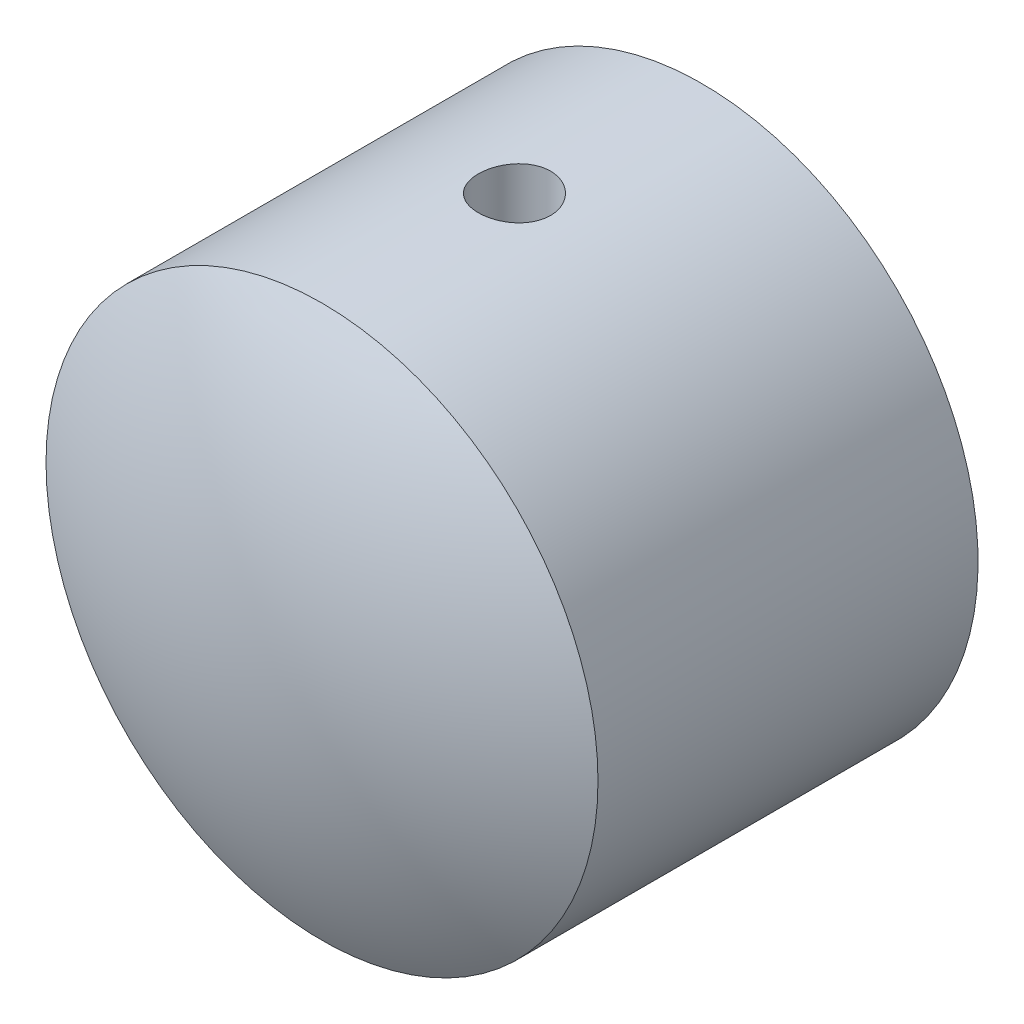
ISO-10303-21;
HEADER;
FILE_DESCRIPTION(('STEP AP214'),'2;1');
FILE_NAME('part.step','',(''),(''),'','','');
FILE_SCHEMA(('AUTOMOTIVE_DESIGN { 1 0 10303 214 1 1 1 1 }'));
ENDSEC;
DATA;
#1=APPLICATION_CONTEXT('core data for automotive mechanical design processes');
#2=APPLICATION_PROTOCOL_DEFINITION('international standard','automotive_design',2000,#1);
#3=PRODUCT_CONTEXT('',#1,'mechanical');
#4=PRODUCT('Part','Part','',(#3));
#5=PRODUCT_RELATED_PRODUCT_CATEGORY('part','',(#4));
#6=PRODUCT_DEFINITION_FORMATION('','',#4);
#7=PRODUCT_DEFINITION_CONTEXT('part definition',#1,'design');
#8=PRODUCT_DEFINITION('design','',#6,#7);
#9=PRODUCT_DEFINITION_SHAPE('','',#8);
#10=(LENGTH_UNIT() NAMED_UNIT(*) SI_UNIT(.MILLI.,.METRE.));
#11=(NAMED_UNIT(*) PLANE_ANGLE_UNIT() SI_UNIT($,.RADIAN.));
#12=(NAMED_UNIT(*) SI_UNIT($,.STERADIAN.) SOLID_ANGLE_UNIT());
#13=UNCERTAINTY_MEASURE_WITH_UNIT(LENGTH_MEASURE(1.E-05),#10,'distance_accuracy_value','');
#14=(GEOMETRIC_REPRESENTATION_CONTEXT(3) GLOBAL_UNCERTAINTY_ASSIGNED_CONTEXT((#13)) GLOBAL_UNIT_ASSIGNED_CONTEXT((#10,
#11,#12)) REPRESENTATION_CONTEXT('',''));
#15=CARTESIAN_POINT('',(0.,0.,0.));
#16=DIRECTION('',(0.,0.,1.));
#17=DIRECTION('',(1.,0.,0.));
#18=AXIS2_PLACEMENT_3D('',#15,#16,#17);
#19=CARTESIAN_POINT('',(67.1144928825525,307.327144706562,47.625));
#20=DIRECTION('',(0.,0.,-1.));
#21=DIRECTION('',(-1.,0.,0.));
#22=AXIS2_PLACEMENT_3D('',#19,#20,#21);
#23=CYLINDRICAL_SURFACE('',#22,36.4267675437894);
#24=CARTESIAN_POINT('',(67.1144928825528,270.900377162773,26.9874999999998));
#25=CARTESIAN_POINT('',(67.3807861241553,270.900381014889,26.9874887516836));
#26=CARTESIAN_POINT('',(67.6472432346548,270.903328005808,26.9650901565895));
#27=CARTESIAN_POINT('',(68.1727357439868,270.914800637117,26.8760953817906));
#28=CARTESIAN_POINT('',(68.4317632186264,270.923332018394,26.8094537181482));
#29=CARTESIAN_POINT('',(68.9347133640755,270.945012830305,26.6339759077728));
#30=CARTESIAN_POINT('',(69.1786463364318,270.958159069622,26.5251689142879));
#31=CARTESIAN_POINT('',(69.6447460131086,270.987609502614,26.2685145129294));
#32=CARTESIAN_POINT('',(69.8669162897577,271.003913176685,26.1206735272262));
#33=CARTESIAN_POINT('',(70.2845614529954,271.03796913155,25.7892001819833));
#34=CARTESIAN_POINT('',(70.4798869022755,271.055728707038,25.605380266732));
#35=CARTESIAN_POINT('',(70.8370103149681,271.09063640758,25.2075700118016));
#36=CARTESIAN_POINT('',(70.9988065249047,271.107784500616,24.9935780952027));
#37=CARTESIAN_POINT('',(71.2848409860774,271.139599166054,24.5405196705663));
#38=CARTESIAN_POINT('',(71.4089381977963,271.154256331489,24.3013634009049));
#39=CARTESIAN_POINT('',(71.6151511670651,271.179332535277,23.805380734277));
#40=CARTESIAN_POINT('',(71.6972686636197,271.189751749183,23.5485550697633));
#41=CARTESIAN_POINT('',(71.8167348050109,271.205102150723,23.026079865457));
#42=CARTESIAN_POINT('',(71.8543366125666,271.210064360996,22.7604891398812));
#43=CARTESIAN_POINT('',(71.8844875663208,271.214033661954,22.2267243598319));
#44=CARTESIAN_POINT('',(71.877038689033,271.213041013899,21.9585504192074));
#45=CARTESIAN_POINT('',(71.8175073336526,271.205241144207,21.4290011212375));
#46=CARTESIAN_POINT('',(71.7657043801783,271.198470338082,21.1675937272159));
#47=CARTESIAN_POINT('',(71.6193718028579,271.179933863407,20.6572142304974));
#48=CARTESIAN_POINT('',(71.5248412392056,271.168168084993,20.4082424014583));
#49=CARTESIAN_POINT('',(71.2954384627023,271.140926304809,19.9289368938399));
#50=CARTESIAN_POINT('',(71.1604454399105,271.125439220084,19.6986616923306));
#51=CARTESIAN_POINT('',(70.8540360397852,271.092508269374,19.2639271258059));
#52=CARTESIAN_POINT('',(70.6826178408722,271.075064305549,19.0594690526899));
#53=CARTESIAN_POINT('',(70.3066780451414,271.040023412352,18.680550615389));
#54=CARTESIAN_POINT('',(70.1019156403467,271.022426324795,18.5063290919186));
#55=CARTESIAN_POINT('',(69.6659272108465,270.989185295135,18.1946911571787));
#56=CARTESIAN_POINT('',(69.4347011149398,270.973541358286,18.0572748449378));
#57=CARTESIAN_POINT('',(68.9521598923842,270.945958248432,17.8231453242324));
#58=CARTESIAN_POINT('',(68.7008370629001,270.934020504607,17.7264478126355));
#59=CARTESIAN_POINT('',(68.1853303768899,270.915207543798,17.5766942269176));
#60=CARTESIAN_POINT('',(67.9211471801636,270.908332067386,17.5236359163864));
#61=CARTESIAN_POINT('',(67.389483267697,270.90045217565,17.4629781365744));
#62=CARTESIAN_POINT('',(67.1220406781685,270.899405287334,17.4550497951384));
#63=CARTESIAN_POINT('',(66.5896404839542,270.903185650703,17.4840080355571));
#64=CARTESIAN_POINT('',(66.3246828213981,270.908012765247,17.5208935711381));
#65=CARTESIAN_POINT('',(65.805749569647,270.922972348716,17.6381592425366));
#66=CARTESIAN_POINT('',(65.5517377784626,270.933085596716,17.7183818355404));
#67=CARTESIAN_POINT('',(65.0607721660446,270.95748567739,17.9198801043763));
#68=CARTESIAN_POINT('',(64.8238189734916,270.971772663784,18.0411572923033));
#69=CARTESIAN_POINT('',(64.3722328449381,271.003034410468,18.3221126446941));
#70=CARTESIAN_POINT('',(64.1577327475952,271.020023816181,18.4820026658527));
#71=CARTESIAN_POINT('',(63.7584949609788,271.054746030348,18.8353463038362));
#72=CARTESIAN_POINT('',(63.5737585693709,271.072478871172,19.0288013832981));
#73=CARTESIAN_POINT('',(63.2381189270215,271.106821188383,19.4452357124111));
#74=CARTESIAN_POINT('',(63.08743421788,271.123422955958,19.6683918324382));
#75=CARTESIAN_POINT('',(62.8256870754998,271.153494489676,20.1370389638466));
#76=CARTESIAN_POINT('',(62.7146237858622,271.166964323514,20.3825294923359));
#77=CARTESIAN_POINT('',(62.5356227684183,271.189193601434,20.8881832003715));
#78=CARTESIAN_POINT('',(62.4675635889551,271.197966300299,21.1483027783875));
#79=CARTESIAN_POINT('',(62.3761125250798,271.209845429407,21.6764010165034));
#80=CARTESIAN_POINT('',(62.3527183507961,271.212952150131,21.9443792729918));
#81=CARTESIAN_POINT('',(62.351306059454,271.213138572702,22.4784129773044));
#82=CARTESIAN_POINT('',(62.372944561122,271.210263883777,22.7444675660436));
#83=CARTESIAN_POINT('',(62.4602543747032,271.198909675481,23.2691228082971));
#84=CARTESIAN_POINT('',(62.5259256770981,271.190430157322,23.5277234634227));
#85=CARTESIAN_POINT('',(62.6993264677828,271.168836220301,24.0300741336865));
#86=CARTESIAN_POINT('',(62.8070377961547,271.155723802933,24.2738305085817));
#87=CARTESIAN_POINT('',(63.0614273652993,271.126338408777,24.7398653879614));
#88=CARTESIAN_POINT('',(63.2081062748798,271.110065377746,24.9621435237215));
#89=CARTESIAN_POINT('',(63.5375359659515,271.07604381269,25.380665523879));
#90=CARTESIAN_POINT('',(63.7205424025177,271.058285369323,25.5767073660973));
#91=CARTESIAN_POINT('',(64.1168963135129,271.023380410382,25.9354276736346));
#92=CARTESIAN_POINT('',(64.3302509065774,271.006234039562,26.0980982892839));
#93=CARTESIAN_POINT('',(64.7822685276633,270.974405763912,26.3860412856509));
#94=CARTESIAN_POINT('',(65.0210330089337,270.959734392745,26.5111555011815));
#95=CARTESIAN_POINT('',(65.5162472059345,270.93461490601,26.719330554709));
#96=CARTESIAN_POINT('',(65.7726775568158,270.924162249594,26.8024366329723));
#97=CARTESIAN_POINT('',(66.2110809992565,270.911149282279,26.9045637909272));
#98=CARTESIAN_POINT('',(66.3903010440371,270.907129642774,26.9356195756918));
#99=CARTESIAN_POINT('',(66.7511529334709,270.901742279823,26.9770914317823));
#100=CARTESIAN_POINT('',(66.9327847579771,270.900374534239,26.9875076754122));
#101=CARTESIAN_POINT('',(67.1144928825528,270.900377162773,26.9874999999998));
#102=B_SPLINE_CURVE_WITH_KNOTS('',3,(#24,#25,#26,#27,#28,#29,#30,#31,#32,#33,#34,#35,#36,#37,
#38,#39,#40,#41,#42,#43,#44,#45,#46,#47,#48,#49,#50,#51,#52,#53,#54,#55,#56,#57,#58,#59,#60,#61,
#62,#63,#64,#65,#66,#67,#68,#69,#70,#71,#72,#73,#74,#75,#76,#77,#78,#79,#80,#81,#82,#83,#84,#85,
#86,#87,#88,#89,#90,#91,#92,#93,#94,#95,#96,#97,#98,#99,#100,#101),.UNSPECIFIED.,.T.,.F.,(4,2,2,
2,2,2,2,2,2,2,2,2,2,2,2,2,2,2,2,2,2,2,2,2,2,2,2,2,2,2,2,2,2,2,2,2,2,2,4),(0.,0.798215948677364,
1.59725377392052,2.39574012462125,3.19409518402807,3.99672852472909,4.7994038300908,
5.6050461360937,6.41065506575209,7.21166010966651,8.01263001125435,8.80858895056784,
9.6045653980823,10.4029424985758,11.2013595343572,12.0058215909523,12.8102858120247,
13.6150598662385,14.4197926750345,15.2186536340678,16.0174959423803,16.8134535790941,
17.6094405351691,18.4098982230728,19.2103908006327,20.0158835376897,20.821358863332,
21.6245490869639,22.4276981317831,23.224745482981,24.0217926618844,24.8184959228148,
25.6152128585938,26.417749278105,27.2204742564875,28.0265338770913,28.8317235599864,
29.376399545873,29.9210709846511),.UNSPECIFIED.);
#103=CARTESIAN_POINT('',(67.1144928825528,270.900377162773,26.9874999999998));
#104=VERTEX_POINT('',#103);
#105=EDGE_CURVE('E10',#104,#104,#102,.T.);
#106=ORIENTED_EDGE('',*,*,#105,.T.);
#107=EDGE_LOOP('',(#106));
#108=FACE_BOUND('',#107,.T.);
#109=CARTESIAN_POINT('',(67.1144928825525,343.753912250352,26.9874999999998));
#110=CARTESIAN_POINT('',(66.8481996409499,343.753908398235,26.9874887516836));
#111=CARTESIAN_POINT('',(66.5817425304505,343.750961407316,26.9650901565894));
#112=CARTESIAN_POINT('',(66.0562500211185,343.739488776008,26.8760953817905));
#113=CARTESIAN_POINT('',(65.7972225464789,343.730957394731,26.8094537181481));
#114=CARTESIAN_POINT('',(65.2942724010298,343.709276582819,26.6339759077727));
#115=CARTESIAN_POINT('',(65.0503394286735,343.696130343502,26.5251689142877));
#116=CARTESIAN_POINT('',(64.5842397519967,343.666679910511,26.2685145129292));
#117=CARTESIAN_POINT('',(64.3620694753476,343.65037623644,26.1206735272261));
#118=CARTESIAN_POINT('',(63.9444243121099,343.616320281575,25.789200181983));
#119=CARTESIAN_POINT('',(63.7490988628298,343.598560706087,25.6053802667318));
#120=CARTESIAN_POINT('',(63.3919754501373,343.563653005545,25.2075700118013));
#121=CARTESIAN_POINT('',(63.2301792402006,343.546504912509,24.9935780952025));
#122=CARTESIAN_POINT('',(62.944144779028,343.514690247071,24.540519670566));
#123=CARTESIAN_POINT('',(62.8200475673091,343.500033081636,24.3013634009046));
#124=CARTESIAN_POINT('',(62.6138345980404,343.474956877848,23.8053807342767));
#125=CARTESIAN_POINT('',(62.5317171014858,343.464537663942,23.548555069763));
#126=CARTESIAN_POINT('',(62.4122509600946,343.449187262401,23.0260798654566));
#127=CARTESIAN_POINT('',(62.3746491525389,343.444225052129,22.7604891398809));
#128=CARTESIAN_POINT('',(62.3444981987847,343.440255751171,22.2267243598316));
#129=CARTESIAN_POINT('',(62.3519470760726,343.441248399226,21.9585504192071));
#130=CARTESIAN_POINT('',(62.411478431453,343.449048268917,21.4290011212372));
#131=CARTESIAN_POINT('',(62.4632813849273,343.455819075043,21.1675937272156));
#132=CARTESIAN_POINT('',(62.6096139622478,343.474355549718,20.6572142304971));
#133=CARTESIAN_POINT('',(62.7041445259001,343.486121328131,20.408242401458));
#134=CARTESIAN_POINT('',(62.9335473024035,343.513363108316,19.9289368938396));
#135=CARTESIAN_POINT('',(63.0685403251953,343.528850193041,19.6986616923303));
#136=CARTESIAN_POINT('',(63.3749497253205,343.561781143751,19.2639271258057));
#137=CARTESIAN_POINT('',(63.5463679242336,343.579225107576,19.0594690526897));
#138=CARTESIAN_POINT('',(63.9223077199644,343.614266000773,18.6805506153888));
#139=CARTESIAN_POINT('',(64.1270701247591,343.63186308833,18.5063290919184));
#140=CARTESIAN_POINT('',(64.5630585542593,343.66510411799,18.1946911571785));
#141=CARTESIAN_POINT('',(64.794284650166,343.680748054839,18.0572748449376));
#142=CARTESIAN_POINT('',(65.2768258727216,343.708331164693,17.8231453242323));
#143=CARTESIAN_POINT('',(65.5281487022058,343.720268908517,17.7264478126354));
#144=CARTESIAN_POINT('',(66.043655388216,343.739081869326,17.5766942269175));
#145=CARTESIAN_POINT('',(66.3078385849423,343.745957345739,17.5236359163863));
#146=CARTESIAN_POINT('',(66.8395024974089,343.753837237475,17.4629781365744));
#147=CARTESIAN_POINT('',(67.1069450869374,343.75488412579,17.4550497951384));
#148=CARTESIAN_POINT('',(67.6393452811517,343.751103762421,17.4840080355571));
#149=CARTESIAN_POINT('',(67.9043029437078,343.746276647878,17.5208935711381));
#150=CARTESIAN_POINT('',(68.4232361954588,343.731317064409,17.6381592425367));
#151=CARTESIAN_POINT('',(68.6772479866433,343.721203816409,17.7183818355405));
#152=CARTESIAN_POINT('',(69.1682135990613,343.696803735735,17.9198801043764));
#153=CARTESIAN_POINT('',(69.4051667916142,343.68251674934,18.0411572923035));
#154=CARTESIAN_POINT('',(69.8567529201677,343.651255002657,18.3221126446942));
#155=CARTESIAN_POINT('',(70.0712530175106,343.634265596944,18.4820026658529));
#156=CARTESIAN_POINT('',(70.470490804127,343.599543382777,18.8353463038364));
#157=CARTESIAN_POINT('',(70.6552271957349,343.581810541953,19.0288013832984));
#158=CARTESIAN_POINT('',(70.9908668380842,343.547468224741,19.4452357124114));
#159=CARTESIAN_POINT('',(71.1415515472257,343.530866457167,19.6683918324385));
#160=CARTESIAN_POINT('',(71.4032986896059,343.500794923448,20.1370389638469));
#161=CARTESIAN_POINT('',(71.5143619792435,343.487325089611,20.3825294923362));
#162=CARTESIAN_POINT('',(71.6933629966873,343.46509581169,20.8881832003719));
#163=CARTESIAN_POINT('',(71.7614221761506,343.456323112825,21.1483027783878));
#164=CARTESIAN_POINT('',(71.8528732400258,343.444443983718,21.6764010165037));
#165=CARTESIAN_POINT('',(71.8762674143095,343.441337262994,21.9443792729921));
#166=CARTESIAN_POINT('',(71.8776797056516,343.441150840423,22.4784129773047));
#167=CARTESIAN_POINT('',(71.8560412039836,343.444025529348,22.7444675660439));
#168=CARTESIAN_POINT('',(71.7687313904023,343.455379737643,23.2691228082974));
#169=CARTESIAN_POINT('',(71.7030600880074,343.463859255803,23.527723463423));
#170=CARTESIAN_POINT('',(71.5296592973226,343.485453192823,24.0300741336868));
#171=CARTESIAN_POINT('',(71.4219479689507,343.498565610192,24.273830508582));
#172=CARTESIAN_POINT('',(71.1675583998061,343.527951004347,24.7398653879616));
#173=CARTESIAN_POINT('',(71.0208794902256,343.544224035379,24.9621435237218));
#174=CARTESIAN_POINT('',(70.6914497991539,343.578245600435,25.3806655238792));
#175=CARTESIAN_POINT('',(70.5084433625877,343.596004043802,25.5767073660975));
#176=CARTESIAN_POINT('',(70.1120894515924,343.630909002743,25.9354276736348));
#177=CARTESIAN_POINT('',(69.8987348585279,343.648055373562,26.0980982892841));
#178=CARTESIAN_POINT('',(69.446717237442,343.679883649212,26.386041285651));
#179=CARTESIAN_POINT('',(69.2079527561716,343.69455502038,26.5111555011816));
#180=CARTESIAN_POINT('',(68.7127385591707,343.719674507115,26.7193305547091));
#181=CARTESIAN_POINT('',(68.4563082082895,343.730127163531,26.8024366329724));
#182=CARTESIAN_POINT('',(68.0179047658488,343.743140130845,26.9045637909273));
#183=CARTESIAN_POINT('',(67.8386847210681,343.747159770351,26.9356195756919));
#184=CARTESIAN_POINT('',(67.4778328316343,343.752547133302,26.9770914317823));
#185=CARTESIAN_POINT('',(67.2962010071281,343.753914878886,26.9875076754122));
#186=CARTESIAN_POINT('',(67.1144928825525,343.753912250352,26.9874999999998));
#187=B_SPLINE_CURVE_WITH_KNOTS('',3,(#109,#110,#111,#112,#113,#114,#115,#116,#117,#118,#119,
#120,#121,#122,#123,#124,#125,#126,#127,#128,#129,#130,#131,#132,#133,#134,#135,#136,#137,#138,
#139,#140,#141,#142,#143,#144,#145,#146,#147,#148,#149,#150,#151,#152,#153,#154,#155,#156,#157,
#158,#159,#160,#161,#162,#163,#164,#165,#166,#167,#168,#169,#170,#171,#172,#173,#174,#175,#176,
#177,#178,#179,#180,#181,#182,#183,#184,#185,#186),.UNSPECIFIED.,.T.,.F.,(4,2,2,2,2,2,2,2,2,2,2,
2,2,2,2,2,2,2,2,2,2,2,2,2,2,2,2,2,2,2,2,2,2,2,2,2,2,2,4),(0.,0.798215948677341,1.59725377392052,
2.39574012462125,3.19409518402807,3.99672852472908,4.79940383009079,5.6050461360937,
6.41065506575209,7.2116601096665,8.01263001125435,8.80858895056785,9.60456539808231,
10.4029424985758,11.2013595343572,12.0058215909523,12.8102858120247,13.6150598662385,
14.4197926750345,15.2186536340678,16.0174959423803,16.813453579094,17.6094405351691,
18.4098982230728,19.2103908006327,20.0158835376897,20.821358863332,21.6245490869639,
22.4276981317831,23.224745482981,24.0217926618844,24.8184959228148,25.6152128585938,
26.417749278105,27.2204742564875,28.0265338770913,28.8317235599864,29.376399545873,
29.9210709846511),.UNSPECIFIED.);
#188=CARTESIAN_POINT('',(67.1144928825525,343.753912250352,26.9874999999998));
#189=VERTEX_POINT('',#188);
#190=EDGE_CURVE('E41',#189,#189,#187,.T.);
#191=ORIENTED_EDGE('',*,*,#190,.T.);
#192=EDGE_LOOP('',(#191));
#193=FACE_BOUND('',#192,.T.);
#194=CARTESIAN_POINT('',(67.1144928825525,307.327144706562,47.625));
#195=DIRECTION('',(0.,0.,1.));
#196=DIRECTION('',(1.,0.,0.));
#197=AXIS2_PLACEMENT_3D('',#194,#195,#196);
#198=CIRCLE('',#197,36.4267675437894);
#199=CARTESIAN_POINT('',(103.541260426342,307.327144706562,47.625));
#200=VERTEX_POINT('',#199);
#201=EDGE_CURVE('E45',#200,#200,#198,.T.);
#202=ORIENTED_EDGE('',*,*,#201,.F.);
#203=EDGE_LOOP('',(#202));
#204=FACE_BOUND('',#203,.T.);
#205=CARTESIAN_POINT('',(67.1144928825525,307.327144706562,-2.53999999999999));
#206=DIRECTION('',(0.,0.,-1.));
#207=DIRECTION('',(-1.,0.,0.));
#208=AXIS2_PLACEMENT_3D('',#205,#206,#207);
#209=CIRCLE('',#208,36.4267675437894);
#210=CARTESIAN_POINT('',(30.687725338763,307.327144706562,-2.53999999999999));
#211=VERTEX_POINT('',#210);
#212=EDGE_CURVE('E49',#211,#211,#209,.T.);
#213=ORIENTED_EDGE('',*,*,#212,.F.);
#214=EDGE_LOOP('',(#213));
#215=FACE_BOUND('',#214,.T.);
#216=ADVANCED_FACE('F31',(#108,#193,#204,#215),#23,.T.);
#217=CARTESIAN_POINT('',(67.1144928825525,307.327144706562,-17.2665364141349));
#218=DIRECTION('',(0.,0.,-1.));
#219=DIRECTION('',(0.,1.,0.));
#220=AXIS2_PLACEMENT_3D('',#217,#218,#219);
#221=SPHERICAL_SURFACE('',#220,74.4165364141349);
#222=ORIENTED_EDGE('',*,*,#201,.T.);
#223=EDGE_LOOP('',(#222));
#224=FACE_BOUND('',#223,.T.);
#225=ADVANCED_FACE('F62',(#224),#221,.T.);
#226=CARTESIAN_POINT('',(67.1144928825525,307.327144706562,62.3515364141349));
#227=DIRECTION('',(0.,0.,-1.));
#228=DIRECTION('',(0.,-1.,0.));
#229=AXIS2_PLACEMENT_3D('',#226,#227,#228);
#230=SPHERICAL_SURFACE('',#229,74.4165364141349);
#231=ORIENTED_EDGE('',*,*,#212,.T.);
#232=EDGE_LOOP('',(#231));
#233=FACE_BOUND('',#232,.T.);
#234=ADVANCED_FACE('F58',(#233),#230,.T.);
#235=CARTESIAN_POINT('',(67.1144928825528,270.900377162773,22.225));
#236=DIRECTION('',(0.,1.,0.));
#237=DIRECTION('',(0.,0.,1.));
#238=AXIS2_PLACEMENT_3D('',#235,#236,#237);
#239=CYLINDRICAL_SURFACE('',#238,4.76249999999985);
#240=ORIENTED_EDGE('',*,*,#190,.F.);
#241=EDGE_LOOP('',(#240));
#242=FACE_BOUND('',#241,.T.);
#243=ORIENTED_EDGE('',*,*,#105,.F.);
#244=EDGE_LOOP('',(#243));
#245=FACE_BOUND('',#244,.T.);
#246=ADVANCED_FACE('F54',(#242,#245),#239,.F.);
#247=CLOSED_SHELL('',(#216,#225,#234,#246));
#248=MANIFOLD_SOLID_BREP('B2',#247);
#249=ADVANCED_BREP_SHAPE_REPRESENTATION('',(#18,#248),#14);
#250=SHAPE_DEFINITION_REPRESENTATION(#9,#249);
ENDSEC;
END-ISO-10303-21;
